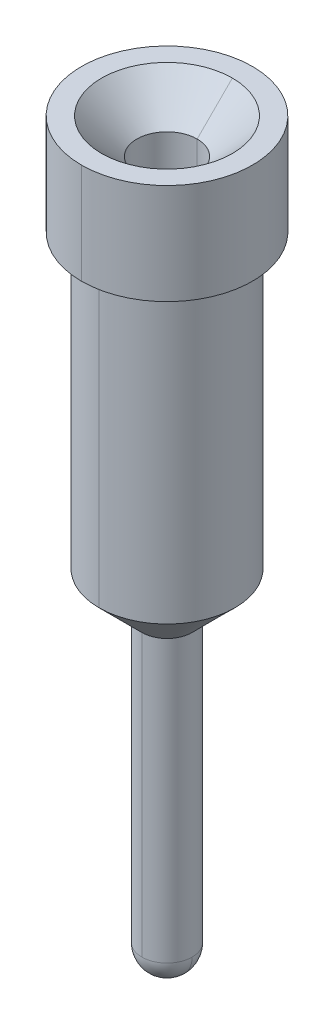
ISO-10303-21;
HEADER;
FILE_DESCRIPTION(('STEP AP214'),'2;1');
FILE_NAME('part.step','',(''),(''),'','','');
FILE_SCHEMA(('AUTOMOTIVE_DESIGN { 1 0 10303 214 1 1 1 1 }'));
ENDSEC;
DATA;
#1=APPLICATION_CONTEXT('core data for automotive mechanical design processes');
#2=APPLICATION_PROTOCOL_DEFINITION('international standard','automotive_design',2000,#1);
#3=PRODUCT_CONTEXT('',#1,'mechanical');
#4=PRODUCT('Part','Part','',(#3));
#5=PRODUCT_RELATED_PRODUCT_CATEGORY('part','',(#4));
#6=PRODUCT_DEFINITION_FORMATION('','',#4);
#7=PRODUCT_DEFINITION_CONTEXT('part definition',#1,'design');
#8=PRODUCT_DEFINITION('design','',#6,#7);
#9=PRODUCT_DEFINITION_SHAPE('','',#8);
#10=(LENGTH_UNIT() NAMED_UNIT(*) SI_UNIT(.MILLI.,.METRE.));
#11=(NAMED_UNIT(*) PLANE_ANGLE_UNIT() SI_UNIT($,.RADIAN.));
#12=(NAMED_UNIT(*) SI_UNIT($,.STERADIAN.) SOLID_ANGLE_UNIT());
#13=UNCERTAINTY_MEASURE_WITH_UNIT(LENGTH_MEASURE(1.E-05),#10,'distance_accuracy_value','');
#14=(GEOMETRIC_REPRESENTATION_CONTEXT(3) GLOBAL_UNCERTAINTY_ASSIGNED_CONTEXT((#13)) GLOBAL_UNIT_ASSIGNED_CONTEXT((#10,
#11,#12)) REPRESENTATION_CONTEXT('',''));
#15=CARTESIAN_POINT('',(0.,0.,0.));
#16=DIRECTION('',(0.,0.,1.));
#17=DIRECTION('',(1.,0.,0.));
#18=AXIS2_PLACEMENT_3D('',#15,#16,#17);
#19=CARTESIAN_POINT('',(0.,-0.35,0.));
#20=DIRECTION('',(0.,1.,0.));
#21=DIRECTION('',(0.,0.,1.));
#22=AXIS2_PLACEMENT_3D('',#19,#20,#21);
#23=CONICAL_SURFACE('',#22,0.299999999999996,0.785398163397446);
#24=DIRECTION('',(0.,0.707106781186549,-0.707106781186546));
#25=VECTOR('',#24,1.);
#26=CARTESIAN_POINT('',(0.,-0.35,-0.299999999999996));
#27=LINE('',#26,#25);
#28=CARTESIAN_POINT('',(0.,-0.35,-0.299999999999996));
#29=VERTEX_POINT('',#28);
#30=CARTESIAN_POINT('',(0.,0.,-0.65));
#31=VERTEX_POINT('',#30);
#32=EDGE_CURVE('E127',#29,#31,#27,.T.);
#33=ORIENTED_EDGE('',*,*,#32,.F.);
#34=CARTESIAN_POINT('',(0.,-0.35,0.));
#35=DIRECTION('',(0.,1.,0.));
#36=DIRECTION('',(0.,0.,1.));
#37=AXIS2_PLACEMENT_3D('',#34,#35,#36);
#38=CIRCLE('',#37,0.299999999999996);
#39=CARTESIAN_POINT('',(0.,-0.35,0.299999999999996));
#40=VERTEX_POINT('',#39);
#41=EDGE_CURVE('E11',#40,#29,#38,.T.);
#42=ORIENTED_EDGE('',*,*,#41,.F.);
#43=DIRECTION('',(0.,0.707106781186549,0.707106781186546));
#44=VECTOR('',#43,1.);
#45=CARTESIAN_POINT('',(0.,-0.35,0.299999999999996));
#46=LINE('',#45,#44);
#47=CARTESIAN_POINT('',(0.,0.,0.65));
#48=VERTEX_POINT('',#47);
#49=EDGE_CURVE('E130',#40,#48,#46,.T.);
#50=ORIENTED_EDGE('',*,*,#49,.T.);
#51=CARTESIAN_POINT('',(0.,0.,0.));
#52=DIRECTION('',(0.,1.,0.));
#53=DIRECTION('',(0.,0.,1.));
#54=AXIS2_PLACEMENT_3D('',#51,#52,#53);
#55=CIRCLE('',#54,0.65);
#56=EDGE_CURVE('E124',#48,#31,#55,.T.);
#57=ORIENTED_EDGE('',*,*,#56,.T.);
#58=EDGE_LOOP('',(#33,#42,#50,#57));
#59=FACE_BOUND('',#58,.T.);
#60=ADVANCED_FACE('F16',(#59),#23,.F.);
#61=CARTESIAN_POINT('',(0.,28.992562867327,0.));
#62=DIRECTION('',(0.,1.,0.));
#63=DIRECTION('',(0.,0.,1.));
#64=AXIS2_PLACEMENT_3D('',#61,#62,#63);
#65=CYLINDRICAL_SURFACE('',#64,0.299999999999995);
#66=DIRECTION('',(0.,1.,0.));
#67=VECTOR('',#66,1.);
#68=CARTESIAN_POINT('',(0.,28.992562867327,-0.299999999999995));
#69=LINE('',#68,#67);
#70=CARTESIAN_POINT('',(0.,-3.7,-0.299999999999995));
#71=VERTEX_POINT('',#70);
#72=EDGE_CURVE('E211',#71,#29,#69,.T.);
#73=ORIENTED_EDGE('',*,*,#72,.F.);
#74=CARTESIAN_POINT('',(0.,-3.7,0.));
#75=DIRECTION('',(0.,1.,0.));
#76=DIRECTION('',(0.,0.,1.));
#77=AXIS2_PLACEMENT_3D('',#74,#75,#76);
#78=CIRCLE('',#77,0.299999999999994);
#79=CARTESIAN_POINT('',(0.,-3.7,0.299999999999995));
#80=VERTEX_POINT('',#79);
#81=EDGE_CURVE('E27',#80,#71,#78,.T.);
#82=ORIENTED_EDGE('',*,*,#81,.F.);
#83=DIRECTION('',(0.,1.,0.));
#84=VECTOR('',#83,1.);
#85=CARTESIAN_POINT('',(0.,28.992562867327,0.299999999999995));
#86=LINE('',#85,#84);
#87=EDGE_CURVE('E215',#80,#40,#86,.T.);
#88=ORIENTED_EDGE('',*,*,#87,.T.);
#89=ORIENTED_EDGE('',*,*,#41,.T.);
#90=EDGE_LOOP('',(#73,#82,#88,#89));
#91=FACE_BOUND('',#90,.T.);
#92=ADVANCED_FACE('F287',(#91),#65,.F.);
#93=CARTESIAN_POINT('',(0.,996.,0.));
#94=DIRECTION('',(0.,1.,0.));
#95=DIRECTION('',(0.,0.,1.));
#96=AXIS2_PLACEMENT_3D('',#93,#94,#95);
#97=CONICAL_SURFACE('',#96,999.999999999986,0.785398163397442);
#98=DIRECTION('',(0.,0.707106781186552,-0.707106781186543));
#99=VECTOR('',#98,1.);
#100=CARTESIAN_POINT('',(0.,-4.,0.));
#101=LINE('',#100,#99);
#102=CARTESIAN_POINT('',(0.,-4.,0.));
#103=VERTEX_POINT('',#102);
#104=EDGE_CURVE('E155',#103,#71,#101,.T.);
#105=ORIENTED_EDGE('',*,*,#104,.F.);
#106=DIRECTION('',(0.,0.707106781186552,0.707106781186543));
#107=VECTOR('',#106,1.);
#108=CARTESIAN_POINT('',(0.,-4.,0.));
#109=LINE('',#108,#107);
#110=EDGE_CURVE('E159',#103,#80,#109,.T.);
#111=ORIENTED_EDGE('',*,*,#110,.T.);
#112=ORIENTED_EDGE('',*,*,#81,.T.);
#113=EDGE_LOOP('',(#105,#111,#112));
#114=FACE_BOUND('',#113,.T.);
#115=ADVANCED_FACE('F279',(#114),#97,.F.);
#116=CARTESIAN_POINT('',(0.,-7.12,0.));
#117=DIRECTION('',(0.,0.,1.));
#118=DIRECTION('',(-1.,0.,0.));
#119=AXIS2_PLACEMENT_3D('',#116,#117,#118);
#120=SPHERICAL_SURFACE('',#119,0.249999999999996);
#121=CARTESIAN_POINT('',(0.,-7.12,0.));
#122=DIRECTION('',(0.,0.,1.));
#123=DIRECTION('',(1.,0.,0.));
#124=AXIS2_PLACEMENT_3D('',#121,#122,#123);
#125=CIRCLE('',#124,0.249999999999996);
#126=CARTESIAN_POINT('',(0.,-7.37,0.));
#127=VERTEX_POINT('',#126);
#128=CARTESIAN_POINT('',(0.249999999999996,-7.12,0.));
#129=VERTEX_POINT('',#128);
#130=EDGE_CURVE('E166',#127,#129,#125,.T.);
#131=ORIENTED_EDGE('',*,*,#130,.F.);
#132=CARTESIAN_POINT('',(0.,-7.12,0.));
#133=DIRECTION('',(0.,0.,-1.));
#134=DIRECTION('',(-1.,0.,0.));
#135=AXIS2_PLACEMENT_3D('',#132,#133,#134);
#136=CIRCLE('',#135,0.249999999999996);
#137=CARTESIAN_POINT('',(-0.249999999999996,-7.12,0.));
#138=VERTEX_POINT('',#137);
#139=EDGE_CURVE('E158',#127,#138,#136,.T.);
#140=ORIENTED_EDGE('',*,*,#139,.T.);
#141=CARTESIAN_POINT('',(0.,-7.12,0.));
#142=DIRECTION('',(0.,1.,0.));
#143=DIRECTION('',(0.,0.,1.));
#144=AXIS2_PLACEMENT_3D('',#141,#142,#143);
#145=CIRCLE('',#144,0.249999999999996);
#146=CARTESIAN_POINT('',(0.,-7.12,-0.249999999999996));
#147=VERTEX_POINT('',#146);
#148=EDGE_CURVE('E183',#147,#138,#145,.T.);
#149=ORIENTED_EDGE('',*,*,#148,.F.);
#150=CARTESIAN_POINT('',(0.,-7.12,0.));
#151=DIRECTION('',(0.,1.,0.));
#152=DIRECTION('',(0.,0.,1.));
#153=AXIS2_PLACEMENT_3D('',#150,#151,#152);
#154=CIRCLE('',#153,0.249999999999996);
#155=EDGE_CURVE('E205',#129,#147,#154,.T.);
#156=ORIENTED_EDGE('',*,*,#155,.F.);
#157=EDGE_LOOP('',(#131,#140,#149,#156));
#158=FACE_BOUND('',#157,.T.);
#159=ADVANCED_FACE('F277',(#158),#120,.T.);
#160=CARTESIAN_POINT('',(0.,28.992562867327,0.));
#161=DIRECTION('',(0.,1.,0.));
#162=DIRECTION('',(0.,0.,1.));
#163=AXIS2_PLACEMENT_3D('',#160,#161,#162);
#164=CYLINDRICAL_SURFACE('',#163,0.249999999999996);
#165=DIRECTION('',(0.,1.,0.));
#166=VECTOR('',#165,1.);
#167=CARTESIAN_POINT('',(0.,28.992562867327,-0.249999999999996));
#168=LINE('',#167,#166);
#169=CARTESIAN_POINT('',(0.,-4.325,-0.249999999999996));
#170=VERTEX_POINT('',#169);
#171=EDGE_CURVE('E176',#147,#170,#168,.T.);
#172=ORIENTED_EDGE('',*,*,#171,.F.);
#173=ORIENTED_EDGE('',*,*,#148,.T.);
#174=CARTESIAN_POINT('',(0.,-7.12,0.));
#175=DIRECTION('',(0.,1.,0.));
#176=DIRECTION('',(0.,0.,1.));
#177=AXIS2_PLACEMENT_3D('',#174,#175,#176);
#178=CIRCLE('',#177,0.249999999999996);
#179=CARTESIAN_POINT('',(0.,-7.12,0.249999999999996));
#180=VERTEX_POINT('',#179);
#181=EDGE_CURVE('E20',#138,#180,#178,.T.);
#182=ORIENTED_EDGE('',*,*,#181,.T.);
#183=DIRECTION('',(0.,1.,0.));
#184=VECTOR('',#183,1.);
#185=CARTESIAN_POINT('',(0.,28.992562867327,0.249999999999996));
#186=LINE('',#185,#184);
#187=CARTESIAN_POINT('',(0.,-4.325,0.249999999999996));
#188=VERTEX_POINT('',#187);
#189=EDGE_CURVE('E175',#180,#188,#186,.T.);
#190=ORIENTED_EDGE('',*,*,#189,.T.);
#191=CARTESIAN_POINT('',(0.,-4.325,0.));
#192=DIRECTION('',(0.,1.,0.));
#193=DIRECTION('',(0.,0.,1.));
#194=AXIS2_PLACEMENT_3D('',#191,#192,#193);
#195=CIRCLE('',#194,0.249999999999996);
#196=EDGE_CURVE('E186',#170,#188,#195,.T.);
#197=ORIENTED_EDGE('',*,*,#196,.F.);
#198=EDGE_LOOP('',(#172,#173,#182,#190,#197));
#199=FACE_BOUND('',#198,.T.);
#200=ADVANCED_FACE('F268',(#199),#164,.T.);
#201=CARTESIAN_POINT('',(0.,-3.9,0.));
#202=DIRECTION('',(0.,1.,0.));
#203=DIRECTION('',(0.,0.,1.));
#204=AXIS2_PLACEMENT_3D('',#201,#202,#203);
#205=CONICAL_SURFACE('',#204,0.675,0.785398163397453);
#206=DIRECTION('',(0.,0.707106781186544,-0.707106781186551));
#207=VECTOR('',#206,1.);
#208=CARTESIAN_POINT('',(0.,-3.9,-0.675));
#209=LINE('',#208,#207);
#210=CARTESIAN_POINT('',(0.,-3.9,-0.675));
#211=VERTEX_POINT('',#210);
#212=EDGE_CURVE('E198',#170,#211,#209,.T.);
#213=ORIENTED_EDGE('',*,*,#212,.F.);
#214=ORIENTED_EDGE('',*,*,#196,.T.);
#215=DIRECTION('',(0.,0.707106781186544,0.707106781186551));
#216=VECTOR('',#215,1.);
#217=CARTESIAN_POINT('',(0.,-3.9,0.675));
#218=LINE('',#217,#216);
#219=CARTESIAN_POINT('',(0.,-3.9,0.675));
#220=VERTEX_POINT('',#219);
#221=EDGE_CURVE('E190',#188,#220,#218,.T.);
#222=ORIENTED_EDGE('',*,*,#221,.T.);
#223=CARTESIAN_POINT('',(0.,-3.9,0.));
#224=DIRECTION('',(0.,1.,0.));
#225=DIRECTION('',(0.,0.,1.));
#226=AXIS2_PLACEMENT_3D('',#223,#224,#225);
#227=CIRCLE('',#226,0.675);
#228=EDGE_CURVE('E225',#211,#220,#227,.T.);
#229=ORIENTED_EDGE('',*,*,#228,.F.);
#230=EDGE_LOOP('',(#213,#214,#222,#229));
#231=FACE_BOUND('',#230,.T.);
#232=ADVANCED_FACE('F260',(#231),#205,.T.);
#233=CARTESIAN_POINT('',(0.,28.992562867327,0.));
#234=DIRECTION('',(0.,1.,0.));
#235=DIRECTION('',(0.,0.,1.));
#236=AXIS2_PLACEMENT_3D('',#233,#234,#235);
#237=CYLINDRICAL_SURFACE('',#236,0.675);
#238=DIRECTION('',(0.,1.,0.));
#239=VECTOR('',#238,1.);
#240=CARTESIAN_POINT('',(0.,28.992562867327,-0.675));
#241=LINE('',#240,#239);
#242=CARTESIAN_POINT('',(0.,-1.,-0.675));
#243=VERTEX_POINT('',#242);
#244=EDGE_CURVE('E165',#211,#243,#241,.T.);
#245=ORIENTED_EDGE('',*,*,#244,.F.);
#246=ORIENTED_EDGE('',*,*,#228,.T.);
#247=DIRECTION('',(0.,1.,0.));
#248=VECTOR('',#247,1.);
#249=CARTESIAN_POINT('',(0.,28.992562867327,0.675));
#250=LINE('',#249,#248);
#251=CARTESIAN_POINT('',(0.,-1.,0.675));
#252=VERTEX_POINT('',#251);
#253=EDGE_CURVE('E164',#220,#252,#250,.T.);
#254=ORIENTED_EDGE('',*,*,#253,.T.);
#255=CARTESIAN_POINT('',(0.,-1.,0.));
#256=DIRECTION('',(0.,1.,0.));
#257=DIRECTION('',(0.,0.,1.));
#258=AXIS2_PLACEMENT_3D('',#255,#256,#257);
#259=CIRCLE('',#258,0.675);
#260=EDGE_CURVE('E200',#243,#252,#259,.T.);
#261=ORIENTED_EDGE('',*,*,#260,.F.);
#262=EDGE_LOOP('',(#245,#246,#254,#261));
#263=FACE_BOUND('',#262,.T.);
#264=ADVANCED_FACE('F302',(#263),#237,.T.);
#265=CARTESIAN_POINT('',(-0.85,-1.,0.));
#266=DIRECTION('',(0.,-1.,0.));
#267=DIRECTION('',(0.,0.,-1.));
#268=AXIS2_PLACEMENT_3D('',#265,#266,#267);
#269=PLANE('',#268);
#270=CARTESIAN_POINT('',(0.,-1.,0.));
#271=DIRECTION('',(0.,1.,0.));
#272=DIRECTION('',(0.,0.,1.));
#273=AXIS2_PLACEMENT_3D('',#270,#271,#272);
#274=CIRCLE('',#273,0.675);
#275=EDGE_CURVE('E160',#252,#243,#274,.T.);
#276=ORIENTED_EDGE('',*,*,#275,.T.);
#277=ORIENTED_EDGE('',*,*,#260,.T.);
#278=EDGE_LOOP('',(#276,#277));
#279=FACE_BOUND('',#278,.T.);
#280=CARTESIAN_POINT('',(0.,-1.,0.));
#281=DIRECTION('',(0.,1.,0.));
#282=DIRECTION('',(0.,0.,1.));
#283=AXIS2_PLACEMENT_3D('',#280,#281,#282);
#284=CIRCLE('',#283,0.85);
#285=CARTESIAN_POINT('',(0.,-1.,0.85));
#286=VERTEX_POINT('',#285);
#287=CARTESIAN_POINT('',(0.,-1.,-0.85));
#288=VERTEX_POINT('',#287);
#289=EDGE_CURVE('E154',#286,#288,#284,.T.);
#290=ORIENTED_EDGE('',*,*,#289,.F.);
#291=CARTESIAN_POINT('',(0.,-1.,0.));
#292=DIRECTION('',(0.,1.,0.));
#293=DIRECTION('',(0.,0.,1.));
#294=AXIS2_PLACEMENT_3D('',#291,#292,#293);
#295=CIRCLE('',#294,0.85);
#296=EDGE_CURVE('E134',#288,#286,#295,.T.);
#297=ORIENTED_EDGE('',*,*,#296,.F.);
#298=EDGE_LOOP('',(#290,#297));
#299=FACE_BOUND('',#298,.T.);
#300=ADVANCED_FACE('F305',(#279,#299),#269,.T.);
#301=CARTESIAN_POINT('',(0.,28.992562867327,0.));
#302=DIRECTION('',(0.,1.,0.));
#303=DIRECTION('',(0.,0.,1.));
#304=AXIS2_PLACEMENT_3D('',#301,#302,#303);
#305=CYLINDRICAL_SURFACE('',#304,0.85);
#306=DIRECTION('',(0.,1.,0.));
#307=VECTOR('',#306,1.);
#308=CARTESIAN_POINT('',(0.,28.992562867327,-0.85));
#309=LINE('',#308,#307);
#310=CARTESIAN_POINT('',(0.,0.,-0.85));
#311=VERTEX_POINT('',#310);
#312=EDGE_CURVE('E248',#288,#311,#309,.T.);
#313=ORIENTED_EDGE('',*,*,#312,.F.);
#314=ORIENTED_EDGE('',*,*,#296,.T.);
#315=DIRECTION('',(0.,1.,0.));
#316=VECTOR('',#315,1.);
#317=CARTESIAN_POINT('',(0.,28.992562867327,0.85));
#318=LINE('',#317,#316);
#319=CARTESIAN_POINT('',(0.,0.,0.85));
#320=VERTEX_POINT('',#319);
#321=EDGE_CURVE('E193',#286,#320,#318,.T.);
#322=ORIENTED_EDGE('',*,*,#321,.T.);
#323=CARTESIAN_POINT('',(0.,0.,0.));
#324=DIRECTION('',(0.,1.,0.));
#325=DIRECTION('',(0.,0.,1.));
#326=AXIS2_PLACEMENT_3D('',#323,#324,#325);
#327=CIRCLE('',#326,0.85);
#328=EDGE_CURVE('E40',#311,#320,#327,.T.);
#329=ORIENTED_EDGE('',*,*,#328,.F.);
#330=EDGE_LOOP('',(#313,#314,#322,#329));
#331=FACE_BOUND('',#330,.T.);
#332=ADVANCED_FACE('F313',(#331),#305,.T.);
#333=CARTESIAN_POINT('',(-0.85,0.,0.));
#334=DIRECTION('',(0.,1.,0.));
#335=DIRECTION('',(1.,0.,0.));
#336=AXIS2_PLACEMENT_3D('',#333,#334,#335);
#337=PLANE('',#336);
#338=ORIENTED_EDGE('',*,*,#56,.F.);
#339=CARTESIAN_POINT('',(0.,0.,0.));
#340=DIRECTION('',(0.,1.,0.));
#341=DIRECTION('',(0.,0.,1.));
#342=AXIS2_PLACEMENT_3D('',#339,#340,#341);
#343=CIRCLE('',#342,0.65);
#344=EDGE_CURVE('E136',#31,#48,#343,.T.);
#345=ORIENTED_EDGE('',*,*,#344,.F.);
#346=EDGE_LOOP('',(#338,#345));
#347=FACE_BOUND('',#346,.T.);
#348=CARTESIAN_POINT('',(0.,0.,0.));
#349=DIRECTION('',(0.,1.,0.));
#350=DIRECTION('',(0.,0.,1.));
#351=AXIS2_PLACEMENT_3D('',#348,#349,#350);
#352=CIRCLE('',#351,0.85);
#353=EDGE_CURVE('E219',#320,#311,#352,.T.);
#354=ORIENTED_EDGE('',*,*,#353,.T.);
#355=ORIENTED_EDGE('',*,*,#328,.T.);
#356=EDGE_LOOP('',(#354,#355));
#357=FACE_BOUND('',#356,.T.);
#358=ADVANCED_FACE('F137',(#347,#357),#337,.T.);
#359=CARTESIAN_POINT('',(0.,28.992562867327,0.));
#360=DIRECTION('',(0.,1.,0.));
#361=DIRECTION('',(0.,0.,1.));
#362=AXIS2_PLACEMENT_3D('',#359,#360,#361);
#363=CYLINDRICAL_SURFACE('',#362,0.85);
#364=ORIENTED_EDGE('',*,*,#289,.T.);
#365=ORIENTED_EDGE('',*,*,#312,.T.);
#366=ORIENTED_EDGE('',*,*,#353,.F.);
#367=ORIENTED_EDGE('',*,*,#321,.F.);
#368=EDGE_LOOP('',(#364,#365,#366,#367));
#369=FACE_BOUND('',#368,.T.);
#370=ADVANCED_FACE('F298',(#369),#363,.T.);
#371=CARTESIAN_POINT('',(0.,28.992562867327,0.));
#372=DIRECTION('',(0.,1.,0.));
#373=DIRECTION('',(0.,0.,1.));
#374=AXIS2_PLACEMENT_3D('',#371,#372,#373);
#375=CYLINDRICAL_SURFACE('',#374,0.675);
#376=CARTESIAN_POINT('',(0.,-3.9,0.));
#377=DIRECTION('',(0.,1.,0.));
#378=DIRECTION('',(0.,0.,1.));
#379=AXIS2_PLACEMENT_3D('',#376,#377,#378);
#380=CIRCLE('',#379,0.675);
#381=EDGE_CURVE('E194',#220,#211,#380,.T.);
#382=ORIENTED_EDGE('',*,*,#381,.T.);
#383=ORIENTED_EDGE('',*,*,#244,.T.);
#384=ORIENTED_EDGE('',*,*,#275,.F.);
#385=ORIENTED_EDGE('',*,*,#253,.F.);
#386=EDGE_LOOP('',(#382,#383,#384,#385));
#387=FACE_BOUND('',#386,.T.);
#388=ADVANCED_FACE('F18',(#387),#375,.T.);
#389=CARTESIAN_POINT('',(0.,-3.9,0.));
#390=DIRECTION('',(0.,1.,0.));
#391=DIRECTION('',(0.,0.,1.));
#392=AXIS2_PLACEMENT_3D('',#389,#390,#391);
#393=CONICAL_SURFACE('',#392,0.675,0.785398163397453);
#394=CARTESIAN_POINT('',(0.,-4.325,0.));
#395=DIRECTION('',(0.,1.,0.));
#396=DIRECTION('',(0.,0.,1.));
#397=AXIS2_PLACEMENT_3D('',#394,#395,#396);
#398=CIRCLE('',#397,0.249999999999996);
#399=EDGE_CURVE('E171',#188,#170,#398,.T.);
#400=ORIENTED_EDGE('',*,*,#399,.T.);
#401=ORIENTED_EDGE('',*,*,#212,.T.);
#402=ORIENTED_EDGE('',*,*,#381,.F.);
#403=ORIENTED_EDGE('',*,*,#221,.F.);
#404=EDGE_LOOP('',(#400,#401,#402,#403));
#405=FACE_BOUND('',#404,.T.);
#406=ADVANCED_FACE('F265',(#405),#393,.T.);
#407=CARTESIAN_POINT('',(0.,28.992562867327,0.));
#408=DIRECTION('',(0.,1.,0.));
#409=DIRECTION('',(0.,0.,1.));
#410=AXIS2_PLACEMENT_3D('',#407,#408,#409);
#411=CYLINDRICAL_SURFACE('',#410,0.249999999999996);
#412=CARTESIAN_POINT('',(0.,-7.12,0.));
#413=DIRECTION('',(0.,1.,0.));
#414=DIRECTION('',(0.,0.,1.));
#415=AXIS2_PLACEMENT_3D('',#412,#413,#414);
#416=CIRCLE('',#415,0.249999999999996);
#417=EDGE_CURVE('E170',#180,#129,#416,.T.);
#418=ORIENTED_EDGE('',*,*,#417,.T.);
#419=ORIENTED_EDGE('',*,*,#155,.T.);
#420=ORIENTED_EDGE('',*,*,#171,.T.);
#421=ORIENTED_EDGE('',*,*,#399,.F.);
#422=ORIENTED_EDGE('',*,*,#189,.F.);
#423=EDGE_LOOP('',(#418,#419,#420,#421,#422));
#424=FACE_BOUND('',#423,.T.);
#425=ADVANCED_FACE('F272',(#424),#411,.T.);
#426=CARTESIAN_POINT('',(0.,-7.12,0.));
#427=DIRECTION('',(0.,0.,1.));
#428=DIRECTION('',(-1.,0.,0.));
#429=AXIS2_PLACEMENT_3D('',#426,#427,#428);
#430=SPHERICAL_SURFACE('',#429,0.249999999999996);
#431=ORIENTED_EDGE('',*,*,#139,.F.);
#432=ORIENTED_EDGE('',*,*,#130,.T.);
#433=ORIENTED_EDGE('',*,*,#417,.F.);
#434=ORIENTED_EDGE('',*,*,#181,.F.);
#435=EDGE_LOOP('',(#431,#432,#433,#434));
#436=FACE_BOUND('',#435,.T.);
#437=ADVANCED_FACE('F276',(#436),#430,.T.);
#438=CARTESIAN_POINT('',(0.,996.,0.));
#439=DIRECTION('',(0.,1.,0.));
#440=DIRECTION('',(0.,0.,1.));
#441=AXIS2_PLACEMENT_3D('',#438,#439,#440);
#442=CONICAL_SURFACE('',#441,999.999999999986,0.785398163397442);
#443=ORIENTED_EDGE('',*,*,#110,.F.);
#444=ORIENTED_EDGE('',*,*,#104,.T.);
#445=CARTESIAN_POINT('',(0.,-3.7,0.));
#446=DIRECTION('',(0.,1.,0.));
#447=DIRECTION('',(0.,0.,1.));
#448=AXIS2_PLACEMENT_3D('',#445,#446,#447);
#449=CIRCLE('',#448,0.299999999999994);
#450=EDGE_CURVE('E216',#71,#80,#449,.T.);
#451=ORIENTED_EDGE('',*,*,#450,.T.);
#452=EDGE_LOOP('',(#443,#444,#451));
#453=FACE_BOUND('',#452,.T.);
#454=ADVANCED_FACE('F310',(#453),#442,.F.);
#455=CARTESIAN_POINT('',(0.,28.992562867327,0.));
#456=DIRECTION('',(0.,1.,0.));
#457=DIRECTION('',(0.,0.,1.));
#458=AXIS2_PLACEMENT_3D('',#455,#456,#457);
#459=CYLINDRICAL_SURFACE('',#458,0.299999999999995);
#460=ORIENTED_EDGE('',*,*,#450,.F.);
#461=ORIENTED_EDGE('',*,*,#72,.T.);
#462=CARTESIAN_POINT('',(0.,-0.35,0.));
#463=DIRECTION('',(0.,1.,0.));
#464=DIRECTION('',(0.,0.,1.));
#465=AXIS2_PLACEMENT_3D('',#462,#463,#464);
#466=CIRCLE('',#465,0.299999999999996);
#467=EDGE_CURVE('E143',#29,#40,#466,.T.);
#468=ORIENTED_EDGE('',*,*,#467,.T.);
#469=ORIENTED_EDGE('',*,*,#87,.F.);
#470=EDGE_LOOP('',(#460,#461,#468,#469));
#471=FACE_BOUND('',#470,.T.);
#472=ADVANCED_FACE('F307',(#471),#459,.F.);
#473=CARTESIAN_POINT('',(0.,-0.35,0.));
#474=DIRECTION('',(0.,1.,0.));
#475=DIRECTION('',(0.,0.,1.));
#476=AXIS2_PLACEMENT_3D('',#473,#474,#475);
#477=CONICAL_SURFACE('',#476,0.299999999999996,0.785398163397446);
#478=ORIENTED_EDGE('',*,*,#467,.F.);
#479=ORIENTED_EDGE('',*,*,#32,.T.);
#480=ORIENTED_EDGE('',*,*,#344,.T.);
#481=ORIENTED_EDGE('',*,*,#49,.F.);
#482=EDGE_LOOP('',(#478,#479,#480,#481));
#483=FACE_BOUND('',#482,.T.);
#484=ADVANCED_FACE('F141',(#483),#477,.F.);
#485=CLOSED_SHELL('',(#60,#92,#115,#159,#200,#232,#264,#300,#332,#358,#370,#388,#406,#425,#437,
#454,#472,#484));
#486=MANIFOLD_SOLID_BREP('B1',#485);
#487=ADVANCED_BREP_SHAPE_REPRESENTATION('',(#18,#486),#14);
#488=SHAPE_DEFINITION_REPRESENTATION(#9,#487);
ENDSEC;
END-ISO-10303-21;
